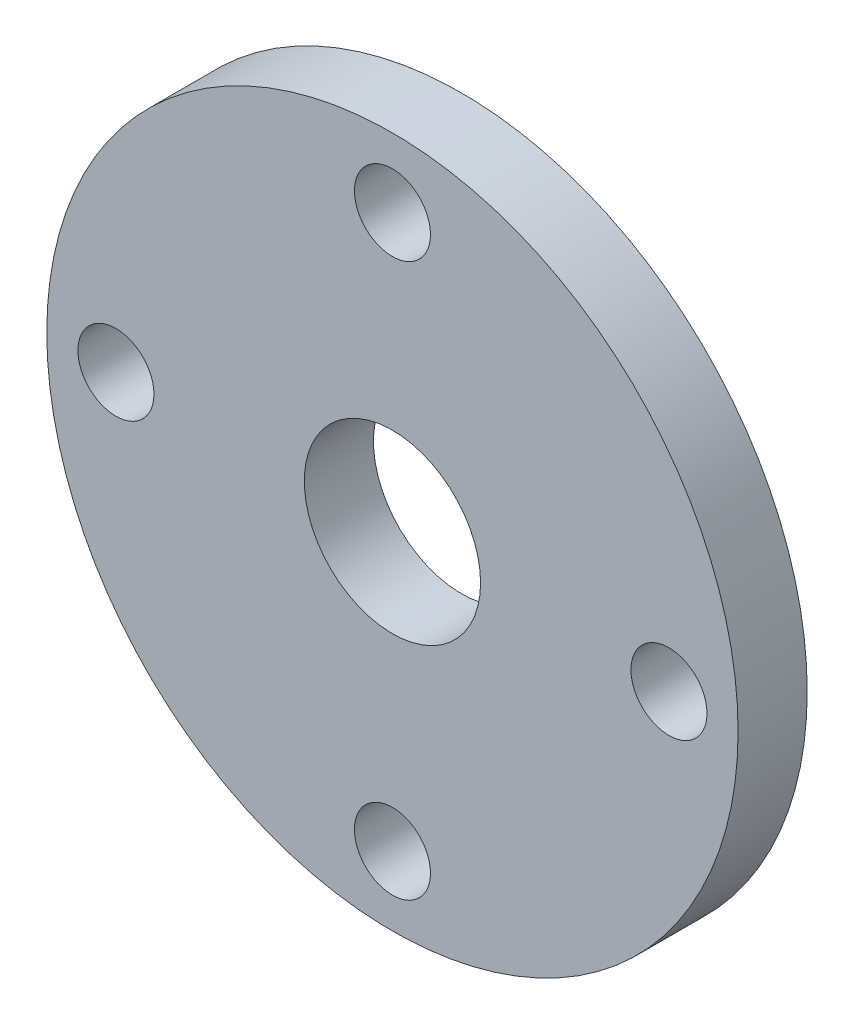
ISO-10303-21;
HEADER;
FILE_DESCRIPTION(('STEP AP214'),'2;1');
FILE_NAME('part.step','',(''),(''),'','','');
FILE_SCHEMA(('AUTOMOTIVE_DESIGN { 1 0 10303 214 1 1 1 1 }'));
ENDSEC;
DATA;
#1=APPLICATION_CONTEXT('core data for automotive mechanical design processes');
#2=APPLICATION_PROTOCOL_DEFINITION('international standard','automotive_design',2000,#1);
#3=PRODUCT_CONTEXT('',#1,'mechanical');
#4=PRODUCT('Part','Part','',(#3));
#5=PRODUCT_RELATED_PRODUCT_CATEGORY('part','',(#4));
#6=PRODUCT_DEFINITION_FORMATION('','',#4);
#7=PRODUCT_DEFINITION_CONTEXT('part definition',#1,'design');
#8=PRODUCT_DEFINITION('design','',#6,#7);
#9=PRODUCT_DEFINITION_SHAPE('','',#8);
#10=(LENGTH_UNIT() NAMED_UNIT(*) SI_UNIT(.MILLI.,.METRE.));
#11=(NAMED_UNIT(*) PLANE_ANGLE_UNIT() SI_UNIT($,.RADIAN.));
#12=(NAMED_UNIT(*) SI_UNIT($,.STERADIAN.) SOLID_ANGLE_UNIT());
#13=UNCERTAINTY_MEASURE_WITH_UNIT(LENGTH_MEASURE(1.E-05),#10,'distance_accuracy_value','');
#14=(GEOMETRIC_REPRESENTATION_CONTEXT(3) GLOBAL_UNCERTAINTY_ASSIGNED_CONTEXT((#13)) GLOBAL_UNIT_ASSIGNED_CONTEXT((#10,
#11,#12)) REPRESENTATION_CONTEXT('',''));
#15=CARTESIAN_POINT('',(0.,0.,0.));
#16=DIRECTION('',(0.,0.,1.));
#17=DIRECTION('',(1.,0.,0.));
#18=AXIS2_PLACEMENT_3D('',#15,#16,#17);
#19=CARTESIAN_POINT('',(0.,0.,2.));
#20=DIRECTION('',(0.,0.,1.));
#21=DIRECTION('',(1.,0.,0.));
#22=AXIS2_PLACEMENT_3D('',#19,#20,#21);
#23=PLANE('',#22);
#24=CARTESIAN_POINT('',(-8.,0.,2.));
#25=DIRECTION('',(0.,0.,1.));
#26=DIRECTION('',(1.,0.,0.));
#27=AXIS2_PLACEMENT_3D('',#24,#25,#26);
#28=CIRCLE('',#27,1.1);
#29=CARTESIAN_POINT('',(-6.9,0.,2.));
#30=VERTEX_POINT('',#29);
#31=EDGE_CURVE('E58',#30,#30,#28,.T.);
#32=ORIENTED_EDGE('',*,*,#31,.F.);
#33=EDGE_LOOP('',(#32));
#34=FACE_BOUND('',#33,.T.);
#35=CARTESIAN_POINT('',(8.,0.,2.));
#36=DIRECTION('',(0.,0.,1.));
#37=DIRECTION('',(1.,0.,0.));
#38=AXIS2_PLACEMENT_3D('',#35,#36,#37);
#39=CIRCLE('',#38,1.1);
#40=CARTESIAN_POINT('',(9.1,0.,2.));
#41=VERTEX_POINT('',#40);
#42=EDGE_CURVE('E85',#41,#41,#39,.T.);
#43=ORIENTED_EDGE('',*,*,#42,.F.);
#44=EDGE_LOOP('',(#43));
#45=FACE_BOUND('',#44,.T.);
#46=CARTESIAN_POINT('',(0.,-8.,2.));
#47=DIRECTION('',(0.,0.,1.));
#48=DIRECTION('',(1.,0.,0.));
#49=AXIS2_PLACEMENT_3D('',#46,#47,#48);
#50=CIRCLE('',#49,1.1);
#51=CARTESIAN_POINT('',(1.1,-8.,2.));
#52=VERTEX_POINT('',#51);
#53=EDGE_CURVE('E79',#52,#52,#50,.T.);
#54=ORIENTED_EDGE('',*,*,#53,.F.);
#55=EDGE_LOOP('',(#54));
#56=FACE_BOUND('',#55,.T.);
#57=CARTESIAN_POINT('',(0.,8.,2.));
#58=DIRECTION('',(0.,0.,1.));
#59=DIRECTION('',(1.,0.,0.));
#60=AXIS2_PLACEMENT_3D('',#57,#58,#59);
#61=CIRCLE('',#60,1.1);
#62=CARTESIAN_POINT('',(1.1,8.,2.));
#63=VERTEX_POINT('',#62);
#64=EDGE_CURVE('E78',#63,#63,#61,.T.);
#65=ORIENTED_EDGE('',*,*,#64,.F.);
#66=EDGE_LOOP('',(#65));
#67=FACE_BOUND('',#66,.T.);
#68=CARTESIAN_POINT('',(0.,0.,2.));
#69=DIRECTION('',(0.,0.,1.));
#70=DIRECTION('',(1.,0.,0.));
#71=AXIS2_PLACEMENT_3D('',#68,#69,#70);
#72=CIRCLE('',#71,10.);
#73=CARTESIAN_POINT('',(10.,0.,2.));
#74=VERTEX_POINT('',#73);
#75=EDGE_CURVE('E10',#74,#74,#72,.T.);
#76=ORIENTED_EDGE('',*,*,#75,.T.);
#77=EDGE_LOOP('',(#76));
#78=FACE_BOUND('',#77,.T.);
#79=CARTESIAN_POINT('',(0.,0.,2.));
#80=DIRECTION('',(0.,0.,1.));
#81=DIRECTION('',(1.,0.,0.));
#82=AXIS2_PLACEMENT_3D('',#79,#80,#81);
#83=CIRCLE('',#82,2.55);
#84=CARTESIAN_POINT('',(2.55,0.,2.));
#85=VERTEX_POINT('',#84);
#86=EDGE_CURVE('E49',#85,#85,#83,.T.);
#87=ORIENTED_EDGE('',*,*,#86,.F.);
#88=EDGE_LOOP('',(#87));
#89=FACE_BOUND('',#88,.T.);
#90=ADVANCED_FACE('F40',(#34,#45,#56,#67,#78,#89),#23,.T.);
#91=CARTESIAN_POINT('',(0.,0.,0.));
#92=DIRECTION('',(0.,0.,1.));
#93=DIRECTION('',(1.,0.,0.));
#94=AXIS2_PLACEMENT_3D('',#91,#92,#93);
#95=PLANE('',#94);
#96=CARTESIAN_POINT('',(-8.,0.,0.));
#97=DIRECTION('',(0.,0.,1.));
#98=DIRECTION('',(1.,0.,0.));
#99=AXIS2_PLACEMENT_3D('',#96,#97,#98);
#100=CIRCLE('',#99,1.1);
#101=CARTESIAN_POINT('',(-6.9,0.,0.));
#102=VERTEX_POINT('',#101);
#103=EDGE_CURVE('E41',#102,#102,#100,.F.);
#104=ORIENTED_EDGE('',*,*,#103,.F.);
#105=EDGE_LOOP('',(#104));
#106=FACE_BOUND('',#105,.T.);
#107=CARTESIAN_POINT('',(8.,0.,0.));
#108=DIRECTION('',(0.,0.,1.));
#109=DIRECTION('',(1.,0.,0.));
#110=AXIS2_PLACEMENT_3D('',#107,#108,#109);
#111=CIRCLE('',#110,1.1);
#112=CARTESIAN_POINT('',(9.1,0.,0.));
#113=VERTEX_POINT('',#112);
#114=EDGE_CURVE('E65',#113,#113,#111,.F.);
#115=ORIENTED_EDGE('',*,*,#114,.F.);
#116=EDGE_LOOP('',(#115));
#117=FACE_BOUND('',#116,.T.);
#118=CARTESIAN_POINT('',(0.,-8.,0.));
#119=DIRECTION('',(0.,0.,1.));
#120=DIRECTION('',(1.,0.,0.));
#121=AXIS2_PLACEMENT_3D('',#118,#119,#120);
#122=CIRCLE('',#121,1.1);
#123=CARTESIAN_POINT('',(1.1,-8.,0.));
#124=VERTEX_POINT('',#123);
#125=EDGE_CURVE('E56',#124,#124,#122,.F.);
#126=ORIENTED_EDGE('',*,*,#125,.F.);
#127=EDGE_LOOP('',(#126));
#128=FACE_BOUND('',#127,.T.);
#129=CARTESIAN_POINT('',(0.,8.,0.));
#130=DIRECTION('',(0.,0.,1.));
#131=DIRECTION('',(1.,0.,0.));
#132=AXIS2_PLACEMENT_3D('',#129,#130,#131);
#133=CIRCLE('',#132,1.1);
#134=CARTESIAN_POINT('',(1.1,8.,0.));
#135=VERTEX_POINT('',#134);
#136=EDGE_CURVE('E57',#135,#135,#133,.F.);
#137=ORIENTED_EDGE('',*,*,#136,.F.);
#138=EDGE_LOOP('',(#137));
#139=FACE_BOUND('',#138,.T.);
#140=CARTESIAN_POINT('',(0.,0.,0.));
#141=DIRECTION('',(0.,0.,1.));
#142=DIRECTION('',(1.,0.,0.));
#143=AXIS2_PLACEMENT_3D('',#140,#141,#142);
#144=CIRCLE('',#143,10.);
#145=CARTESIAN_POINT('',(10.,0.,0.));
#146=VERTEX_POINT('',#145);
#147=EDGE_CURVE('E44',#146,#146,#144,.T.);
#148=ORIENTED_EDGE('',*,*,#147,.F.);
#149=EDGE_LOOP('',(#148));
#150=FACE_BOUND('',#149,.T.);
#151=CARTESIAN_POINT('',(0.,0.,0.));
#152=DIRECTION('',(0.,0.,1.));
#153=DIRECTION('',(1.,0.,0.));
#154=AXIS2_PLACEMENT_3D('',#151,#152,#153);
#155=CIRCLE('',#154,2.55);
#156=CARTESIAN_POINT('',(2.55,0.,0.));
#157=VERTEX_POINT('',#156);
#158=EDGE_CURVE('E52',#157,#157,#155,.T.);
#159=ORIENTED_EDGE('',*,*,#158,.T.);
#160=EDGE_LOOP('',(#159));
#161=FACE_BOUND('',#160,.T.);
#162=ADVANCED_FACE('F95',(#106,#117,#128,#139,#150,#161),#95,.F.);
#163=CARTESIAN_POINT('',(0.,0.,2.));
#164=DIRECTION('',(0.,0.,-1.));
#165=DIRECTION('',(-1.,0.,0.));
#166=AXIS2_PLACEMENT_3D('',#163,#164,#165);
#167=CYLINDRICAL_SURFACE('',#166,10.);
#168=ORIENTED_EDGE('',*,*,#75,.F.);
#169=EDGE_LOOP('',(#168));
#170=FACE_BOUND('',#169,.T.);
#171=ORIENTED_EDGE('',*,*,#147,.T.);
#172=EDGE_LOOP('',(#171));
#173=FACE_BOUND('',#172,.T.);
#174=ADVANCED_FACE('F39',(#170,#173),#167,.T.);
#175=CARTESIAN_POINT('',(0.,0.,2.));
#176=DIRECTION('',(0.,0.,-1.));
#177=DIRECTION('',(-1.,0.,0.));
#178=AXIS2_PLACEMENT_3D('',#175,#176,#177);
#179=CYLINDRICAL_SURFACE('',#178,2.55);
#180=ORIENTED_EDGE('',*,*,#86,.T.);
#181=EDGE_LOOP('',(#180));
#182=FACE_BOUND('',#181,.T.);
#183=ORIENTED_EDGE('',*,*,#158,.F.);
#184=EDGE_LOOP('',(#183));
#185=FACE_BOUND('',#184,.T.);
#186=ADVANCED_FACE('F104',(#182,#185),#179,.F.);
#187=CARTESIAN_POINT('',(0.,8.,2.));
#188=DIRECTION('',(0.,0.,-1.));
#189=DIRECTION('',(-1.,0.,0.));
#190=AXIS2_PLACEMENT_3D('',#187,#188,#189);
#191=CYLINDRICAL_SURFACE('',#190,1.1);
#192=ORIENTED_EDGE('',*,*,#64,.T.);
#193=EDGE_LOOP('',(#192));
#194=FACE_BOUND('',#193,.T.);
#195=ORIENTED_EDGE('',*,*,#136,.T.);
#196=EDGE_LOOP('',(#195));
#197=FACE_BOUND('',#196,.T.);
#198=ADVANCED_FACE('F101',(#194,#197),#191,.F.);
#199=CARTESIAN_POINT('',(0.,-8.,2.));
#200=DIRECTION('',(0.,0.,-1.));
#201=DIRECTION('',(-1.,0.,0.));
#202=AXIS2_PLACEMENT_3D('',#199,#200,#201);
#203=CYLINDRICAL_SURFACE('',#202,1.1);
#204=ORIENTED_EDGE('',*,*,#53,.T.);
#205=EDGE_LOOP('',(#204));
#206=FACE_BOUND('',#205,.T.);
#207=ORIENTED_EDGE('',*,*,#125,.T.);
#208=EDGE_LOOP('',(#207));
#209=FACE_BOUND('',#208,.T.);
#210=ADVANCED_FACE('F102',(#206,#209),#203,.F.);
#211=CARTESIAN_POINT('',(8.,0.,2.));
#212=DIRECTION('',(0.,0.,-1.));
#213=DIRECTION('',(-1.,0.,0.));
#214=AXIS2_PLACEMENT_3D('',#211,#212,#213);
#215=CYLINDRICAL_SURFACE('',#214,1.1);
#216=ORIENTED_EDGE('',*,*,#42,.T.);
#217=EDGE_LOOP('',(#216));
#218=FACE_BOUND('',#217,.T.);
#219=ORIENTED_EDGE('',*,*,#114,.T.);
#220=EDGE_LOOP('',(#219));
#221=FACE_BOUND('',#220,.T.);
#222=ADVANCED_FACE('F127',(#218,#221),#215,.F.);
#223=CARTESIAN_POINT('',(-8.,0.,2.));
#224=DIRECTION('',(0.,0.,-1.));
#225=DIRECTION('',(-1.,0.,0.));
#226=AXIS2_PLACEMENT_3D('',#223,#224,#225);
#227=CYLINDRICAL_SURFACE('',#226,1.1);
#228=ORIENTED_EDGE('',*,*,#31,.T.);
#229=EDGE_LOOP('',(#228));
#230=FACE_BOUND('',#229,.T.);
#231=ORIENTED_EDGE('',*,*,#103,.T.);
#232=EDGE_LOOP('',(#231));
#233=FACE_BOUND('',#232,.T.);
#234=ADVANCED_FACE('F86',(#230,#233),#227,.F.);
#235=CLOSED_SHELL('',(#90,#162,#174,#186,#198,#210,#222,#234));
#236=MANIFOLD_SOLID_BREP('B2',#235);
#237=ADVANCED_BREP_SHAPE_REPRESENTATION('',(#18,#236),#14);
#238=SHAPE_DEFINITION_REPRESENTATION(#9,#237);
ENDSEC;
END-ISO-10303-21;
